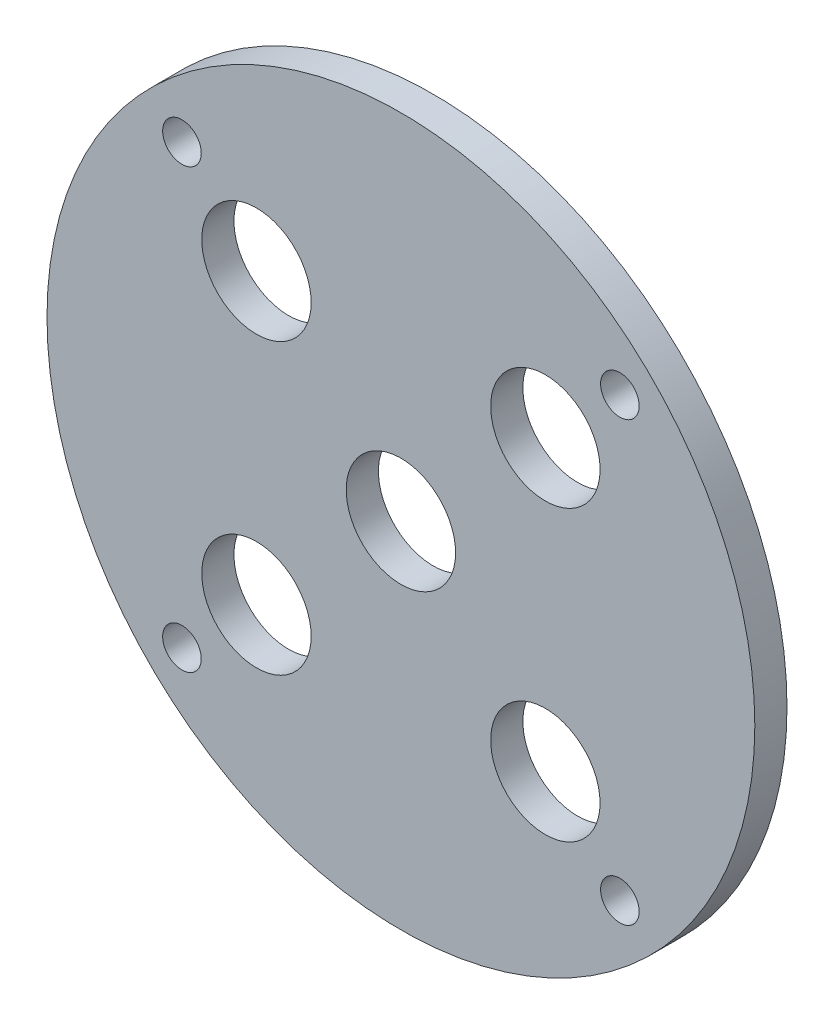
ISO-10303-21;
HEADER;
FILE_DESCRIPTION(('STEP AP214'),'2;1');
FILE_NAME('part.step','',(''),(''),'','','');
FILE_SCHEMA(('AUTOMOTIVE_DESIGN { 1 0 10303 214 1 1 1 1 }'));
ENDSEC;
DATA;
#1=APPLICATION_CONTEXT('core data for automotive mechanical design processes');
#2=APPLICATION_PROTOCOL_DEFINITION('international standard','automotive_design',2000,#1);
#3=PRODUCT_CONTEXT('',#1,'mechanical');
#4=PRODUCT('Part','Part','',(#3));
#5=PRODUCT_RELATED_PRODUCT_CATEGORY('part','',(#4));
#6=PRODUCT_DEFINITION_FORMATION('','',#4);
#7=PRODUCT_DEFINITION_CONTEXT('part definition',#1,'design');
#8=PRODUCT_DEFINITION('design','',#6,#7);
#9=PRODUCT_DEFINITION_SHAPE('','',#8);
#10=(LENGTH_UNIT() NAMED_UNIT(*) SI_UNIT(.MILLI.,.METRE.));
#11=(NAMED_UNIT(*) PLANE_ANGLE_UNIT() SI_UNIT($,.RADIAN.));
#12=(NAMED_UNIT(*) SI_UNIT($,.STERADIAN.) SOLID_ANGLE_UNIT());
#13=UNCERTAINTY_MEASURE_WITH_UNIT(LENGTH_MEASURE(1.E-05),#10,'distance_accuracy_value','');
#14=(GEOMETRIC_REPRESENTATION_CONTEXT(3) GLOBAL_UNCERTAINTY_ASSIGNED_CONTEXT((#13)) GLOBAL_UNIT_ASSIGNED_CONTEXT((#10,
#11,#12)) REPRESENTATION_CONTEXT('',''));
#15=CARTESIAN_POINT('',(0.,0.,0.));
#16=DIRECTION('',(0.,0.,1.));
#17=DIRECTION('',(1.,0.,0.));
#18=AXIS2_PLACEMENT_3D('',#15,#16,#17);
#19=CARTESIAN_POINT('',(-4.49012806053457,-4.4902167152098,1.));
#20=DIRECTION('',(0.,0.,-1.));
#21=DIRECTION('',(-1.,0.,0.));
#22=AXIS2_PLACEMENT_3D('',#19,#20,#21);
#23=CYLINDRICAL_SURFACE('',#22,1.7);
#24=CARTESIAN_POINT('',(-4.49012806053457,-4.4902167152098,1.));
#25=DIRECTION('',(0.,0.,1.));
#26=DIRECTION('',(1.,0.,0.));
#27=AXIS2_PLACEMENT_3D('',#24,#25,#26);
#28=CIRCLE('',#27,1.7);
#29=CARTESIAN_POINT('',(-2.79012806053457,-4.4902167152098,1.));
#30=VERTEX_POINT('',#29);
#31=EDGE_CURVE('E54',#30,#30,#28,.T.);
#32=ORIENTED_EDGE('',*,*,#31,.T.);
#33=EDGE_LOOP('',(#32));
#34=FACE_BOUND('',#33,.T.);
#35=CARTESIAN_POINT('',(-4.49012806053457,-4.4902167152098,0.));
#36=DIRECTION('',(0.,0.,1.));
#37=DIRECTION('',(1.,0.,0.));
#38=AXIS2_PLACEMENT_3D('',#35,#36,#37);
#39=CIRCLE('',#38,1.7);
#40=CARTESIAN_POINT('',(-2.79012806053457,-4.4902167152098,0.));
#41=VERTEX_POINT('',#40);
#42=EDGE_CURVE('E95',#41,#41,#39,.T.);
#43=ORIENTED_EDGE('',*,*,#42,.F.);
#44=EDGE_LOOP('',(#43));
#45=FACE_BOUND('',#44,.T.);
#46=ADVANCED_FACE('F45',(#34,#45),#23,.F.);
#47=CARTESIAN_POINT('',(-4.4901280605346,4.49003940585933,1.));
#48=DIRECTION('',(0.,0.,-1.));
#49=DIRECTION('',(-1.,0.,0.));
#50=AXIS2_PLACEMENT_3D('',#47,#48,#49);
#51=CYLINDRICAL_SURFACE('',#50,1.7);
#52=CARTESIAN_POINT('',(-4.4901280605346,4.49003940585933,1.));
#53=DIRECTION('',(0.,0.,1.));
#54=DIRECTION('',(1.,0.,0.));
#55=AXIS2_PLACEMENT_3D('',#52,#53,#54);
#56=CIRCLE('',#55,1.7);
#57=CARTESIAN_POINT('',(-2.7901280605346,4.49003940585933,1.));
#58=VERTEX_POINT('',#57);
#59=EDGE_CURVE('E60',#58,#58,#56,.T.);
#60=ORIENTED_EDGE('',*,*,#59,.T.);
#61=EDGE_LOOP('',(#60));
#62=FACE_BOUND('',#61,.T.);
#63=CARTESIAN_POINT('',(-4.4901280605346,4.49003940585933,0.));
#64=DIRECTION('',(0.,0.,1.));
#65=DIRECTION('',(1.,0.,0.));
#66=AXIS2_PLACEMENT_3D('',#63,#64,#65);
#67=CIRCLE('',#66,1.7);
#68=CARTESIAN_POINT('',(-2.7901280605346,4.49003940585933,0.));
#69=VERTEX_POINT('',#68);
#70=EDGE_CURVE('E92',#69,#69,#67,.T.);
#71=ORIENTED_EDGE('',*,*,#70,.F.);
#72=EDGE_LOOP('',(#71));
#73=FACE_BOUND('',#72,.T.);
#74=ADVANCED_FACE('F138',(#62,#73),#51,.F.);
#75=CARTESIAN_POINT('',(0.,-8.86546752233539E-05,1.));
#76=DIRECTION('',(0.,0.,-1.));
#77=DIRECTION('',(-1.,0.,0.));
#78=AXIS2_PLACEMENT_3D('',#75,#76,#77);
#79=CYLINDRICAL_SURFACE('',#78,1.7);
#80=CARTESIAN_POINT('',(0.,-8.86546752233539E-05,1.));
#81=DIRECTION('',(0.,0.,1.));
#82=DIRECTION('',(1.,0.,0.));
#83=AXIS2_PLACEMENT_3D('',#80,#81,#82);
#84=CIRCLE('',#83,1.7);
#85=CARTESIAN_POINT('',(1.7,-8.86546752233539E-05,1.));
#86=VERTEX_POINT('',#85);
#87=EDGE_CURVE('E131',#86,#86,#84,.T.);
#88=ORIENTED_EDGE('',*,*,#87,.T.);
#89=EDGE_LOOP('',(#88));
#90=FACE_BOUND('',#89,.T.);
#91=CARTESIAN_POINT('',(0.,-8.86546752233539E-05,0.));
#92=DIRECTION('',(0.,0.,1.));
#93=DIRECTION('',(1.,0.,0.));
#94=AXIS2_PLACEMENT_3D('',#91,#92,#93);
#95=CIRCLE('',#94,1.7);
#96=CARTESIAN_POINT('',(1.7,-8.86546752233539E-05,0.));
#97=VERTEX_POINT('',#96);
#98=EDGE_CURVE('E88',#97,#97,#95,.T.);
#99=ORIENTED_EDGE('',*,*,#98,.F.);
#100=EDGE_LOOP('',(#99));
#101=FACE_BOUND('',#100,.T.);
#102=ADVANCED_FACE('F156',(#90,#101),#79,.F.);
#103=CARTESIAN_POINT('',(4.4901280605346,4.49003940585933,1.));
#104=DIRECTION('',(0.,0.,-1.));
#105=DIRECTION('',(-1.,0.,0.));
#106=AXIS2_PLACEMENT_3D('',#103,#104,#105);
#107=CYLINDRICAL_SURFACE('',#106,1.7);
#108=CARTESIAN_POINT('',(4.4901280605346,4.49003940585933,1.));
#109=DIRECTION('',(0.,0.,1.));
#110=DIRECTION('',(1.,0.,0.));
#111=AXIS2_PLACEMENT_3D('',#108,#109,#110);
#112=CIRCLE('',#111,1.7);
#113=CARTESIAN_POINT('',(6.1901280605346,4.49003940585933,1.));
#114=VERTEX_POINT('',#113);
#115=EDGE_CURVE('E127',#114,#114,#112,.T.);
#116=ORIENTED_EDGE('',*,*,#115,.T.);
#117=EDGE_LOOP('',(#116));
#118=FACE_BOUND('',#117,.T.);
#119=CARTESIAN_POINT('',(4.4901280605346,4.49003940585933,0.));
#120=DIRECTION('',(0.,0.,1.));
#121=DIRECTION('',(1.,0.,0.));
#122=AXIS2_PLACEMENT_3D('',#119,#120,#121);
#123=CIRCLE('',#122,1.7);
#124=CARTESIAN_POINT('',(6.1901280605346,4.49003940585933,0.));
#125=VERTEX_POINT('',#124);
#126=EDGE_CURVE('E84',#125,#125,#123,.T.);
#127=ORIENTED_EDGE('',*,*,#126,.F.);
#128=EDGE_LOOP('',(#127));
#129=FACE_BOUND('',#128,.T.);
#130=ADVANCED_FACE('F163',(#118,#129),#107,.F.);
#131=CARTESIAN_POINT('',(6.80544956505807,-6.80553821973334,1.));
#132=DIRECTION('',(0.,0.,-1.));
#133=DIRECTION('',(-1.,0.,0.));
#134=AXIS2_PLACEMENT_3D('',#131,#132,#133);
#135=CYLINDRICAL_SURFACE('',#134,0.6);
#136=CARTESIAN_POINT('',(6.80544956505807,-6.80553821973334,1.));
#137=DIRECTION('',(0.,0.,1.));
#138=DIRECTION('',(1.,0.,0.));
#139=AXIS2_PLACEMENT_3D('',#136,#137,#138);
#140=CIRCLE('',#139,0.6);
#141=CARTESIAN_POINT('',(7.40544956505807,-6.80553821973334,1.));
#142=VERTEX_POINT('',#141);
#143=EDGE_CURVE('E123',#142,#142,#140,.T.);
#144=ORIENTED_EDGE('',*,*,#143,.T.);
#145=EDGE_LOOP('',(#144));
#146=FACE_BOUND('',#145,.T.);
#147=CARTESIAN_POINT('',(6.80544956505807,-6.80553821973334,0.));
#148=DIRECTION('',(0.,0.,1.));
#149=DIRECTION('',(1.,0.,0.));
#150=AXIS2_PLACEMENT_3D('',#147,#148,#149);
#151=CIRCLE('',#150,0.6);
#152=CARTESIAN_POINT('',(7.40544956505807,-6.80553821973334,0.));
#153=VERTEX_POINT('',#152);
#154=EDGE_CURVE('E80',#153,#153,#151,.T.);
#155=ORIENTED_EDGE('',*,*,#154,.F.);
#156=EDGE_LOOP('',(#155));
#157=FACE_BOUND('',#156,.T.);
#158=ADVANCED_FACE('F167',(#146,#157),#135,.F.);
#159=CARTESIAN_POINT('',(-6.80553821973336,-6.80544956505805,1.));
#160=DIRECTION('',(0.,0.,-1.));
#161=DIRECTION('',(-1.,0.,0.));
#162=AXIS2_PLACEMENT_3D('',#159,#160,#161);
#163=CYLINDRICAL_SURFACE('',#162,0.6);
#164=CARTESIAN_POINT('',(-6.80553821973336,-6.80544956505805,1.));
#165=DIRECTION('',(0.,0.,1.));
#166=DIRECTION('',(1.,0.,0.));
#167=AXIS2_PLACEMENT_3D('',#164,#165,#166);
#168=CIRCLE('',#167,0.6);
#169=CARTESIAN_POINT('',(-6.20553821973336,-6.80544956505805,1.));
#170=VERTEX_POINT('',#169);
#171=EDGE_CURVE('E119',#170,#170,#168,.T.);
#172=ORIENTED_EDGE('',*,*,#171,.T.);
#173=EDGE_LOOP('',(#172));
#174=FACE_BOUND('',#173,.T.);
#175=CARTESIAN_POINT('',(-6.80553821973336,-6.80544956505805,0.));
#176=DIRECTION('',(0.,0.,1.));
#177=DIRECTION('',(1.,0.,0.));
#178=AXIS2_PLACEMENT_3D('',#175,#176,#177);
#179=CIRCLE('',#178,0.6);
#180=CARTESIAN_POINT('',(-6.20553821973336,-6.80544956505805,0.));
#181=VERTEX_POINT('',#180);
#182=EDGE_CURVE('E76',#181,#181,#179,.T.);
#183=ORIENTED_EDGE('',*,*,#182,.F.);
#184=EDGE_LOOP('',(#183));
#185=FACE_BOUND('',#184,.T.);
#186=ADVANCED_FACE('F171',(#174,#185),#163,.F.);
#187=CARTESIAN_POINT('',(-6.80544956505803,6.80553821973339,1.));
#188=DIRECTION('',(0.,0.,-1.));
#189=DIRECTION('',(-1.,0.,0.));
#190=AXIS2_PLACEMENT_3D('',#187,#188,#189);
#191=CYLINDRICAL_SURFACE('',#190,0.6);
#192=CARTESIAN_POINT('',(-6.80544956505803,6.80553821973339,1.));
#193=DIRECTION('',(0.,0.,1.));
#194=DIRECTION('',(1.,0.,0.));
#195=AXIS2_PLACEMENT_3D('',#192,#193,#194);
#196=CIRCLE('',#195,0.6);
#197=CARTESIAN_POINT('',(-6.20544956505803,6.80553821973339,1.));
#198=VERTEX_POINT('',#197);
#199=EDGE_CURVE('E113',#198,#198,#196,.T.);
#200=ORIENTED_EDGE('',*,*,#199,.T.);
#201=EDGE_LOOP('',(#200));
#202=FACE_BOUND('',#201,.T.);
#203=CARTESIAN_POINT('',(-6.80544956505803,6.80553821973339,0.));
#204=DIRECTION('',(0.,0.,1.));
#205=DIRECTION('',(1.,0.,0.));
#206=AXIS2_PLACEMENT_3D('',#203,#204,#205);
#207=CIRCLE('',#206,0.6);
#208=CARTESIAN_POINT('',(-6.20544956505803,6.80553821973339,0.));
#209=VERTEX_POINT('',#208);
#210=EDGE_CURVE('E72',#209,#209,#207,.T.);
#211=ORIENTED_EDGE('',*,*,#210,.F.);
#212=EDGE_LOOP('',(#211));
#213=FACE_BOUND('',#212,.T.);
#214=ADVANCED_FACE('F175',(#202,#213),#191,.F.);
#215=CARTESIAN_POINT('',(6.80553821973331,6.8054495650581,1.));
#216=DIRECTION('',(0.,0.,-1.));
#217=DIRECTION('',(-1.,0.,0.));
#218=AXIS2_PLACEMENT_3D('',#215,#216,#217);
#219=CYLINDRICAL_SURFACE('',#218,0.6);
#220=CARTESIAN_POINT('',(6.80553821973331,6.8054495650581,1.));
#221=DIRECTION('',(0.,0.,1.));
#222=DIRECTION('',(1.,0.,0.));
#223=AXIS2_PLACEMENT_3D('',#220,#221,#222);
#224=CIRCLE('',#223,0.6);
#225=CARTESIAN_POINT('',(7.40553821973331,6.8054495650581,1.));
#226=VERTEX_POINT('',#225);
#227=EDGE_CURVE('E107',#226,#226,#224,.T.);
#228=ORIENTED_EDGE('',*,*,#227,.T.);
#229=EDGE_LOOP('',(#228));
#230=FACE_BOUND('',#229,.T.);
#231=CARTESIAN_POINT('',(6.80553821973331,6.8054495650581,0.));
#232=DIRECTION('',(0.,0.,1.));
#233=DIRECTION('',(1.,0.,0.));
#234=AXIS2_PLACEMENT_3D('',#231,#232,#233);
#235=CIRCLE('',#234,0.6);
#236=CARTESIAN_POINT('',(7.40553821973331,6.8054495650581,0.));
#237=VERTEX_POINT('',#236);
#238=EDGE_CURVE('E68',#237,#237,#235,.T.);
#239=ORIENTED_EDGE('',*,*,#238,.F.);
#240=EDGE_LOOP('',(#239));
#241=FACE_BOUND('',#240,.T.);
#242=ADVANCED_FACE('F178',(#230,#241),#219,.F.);
#243=CARTESIAN_POINT('',(0.,-8.86546752233539E-05,1.));
#244=DIRECTION('',(0.,0.,-1.));
#245=DIRECTION('',(-1.,0.,0.));
#246=AXIS2_PLACEMENT_3D('',#243,#244,#245);
#247=CYLINDRICAL_SURFACE('',#246,11.);
#248=CARTESIAN_POINT('',(0.,-8.86546752233539E-05,1.));
#249=DIRECTION('',(0.,0.,1.));
#250=DIRECTION('',(1.,0.,0.));
#251=AXIS2_PLACEMENT_3D('',#248,#249,#250);
#252=CIRCLE('',#251,11.);
#253=CARTESIAN_POINT('',(11.,-8.86546752233539E-05,1.));
#254=VERTEX_POINT('',#253);
#255=EDGE_CURVE('E102',#254,#254,#252,.T.);
#256=ORIENTED_EDGE('',*,*,#255,.F.);
#257=EDGE_LOOP('',(#256));
#258=FACE_BOUND('',#257,.T.);
#259=CARTESIAN_POINT('',(0.,-8.86546752233539E-05,0.));
#260=DIRECTION('',(0.,0.,1.));
#261=DIRECTION('',(1.,0.,0.));
#262=AXIS2_PLACEMENT_3D('',#259,#260,#261);
#263=CIRCLE('',#262,11.);
#264=CARTESIAN_POINT('',(11.,-8.86546752233539E-05,0.));
#265=VERTEX_POINT('',#264);
#266=EDGE_CURVE('E64',#265,#265,#263,.T.);
#267=ORIENTED_EDGE('',*,*,#266,.T.);
#268=EDGE_LOOP('',(#267));
#269=FACE_BOUND('',#268,.T.);
#270=ADVANCED_FACE('F47',(#258,#269),#247,.T.);
#271=CARTESIAN_POINT('',(4.4901280605346,-4.4902167152098,1.));
#272=DIRECTION('',(0.,0.,-1.));
#273=DIRECTION('',(-1.,0.,0.));
#274=AXIS2_PLACEMENT_3D('',#271,#272,#273);
#275=CYLINDRICAL_SURFACE('',#274,1.7);
#276=CARTESIAN_POINT('',(4.4901280605346,-4.4902167152098,1.));
#277=DIRECTION('',(0.,0.,1.));
#278=DIRECTION('',(1.,0.,0.));
#279=AXIS2_PLACEMENT_3D('',#276,#277,#278);
#280=CIRCLE('',#279,1.7);
#281=CARTESIAN_POINT('',(6.1901280605346,-4.4902167152098,1.));
#282=VERTEX_POINT('',#281);
#283=EDGE_CURVE('E10',#282,#282,#280,.T.);
#284=ORIENTED_EDGE('',*,*,#283,.T.);
#285=EDGE_LOOP('',(#284));
#286=FACE_BOUND('',#285,.T.);
#287=CARTESIAN_POINT('',(4.4901280605346,-4.4902167152098,0.));
#288=DIRECTION('',(0.,0.,1.));
#289=DIRECTION('',(1.,0.,0.));
#290=AXIS2_PLACEMENT_3D('',#287,#288,#289);
#291=CIRCLE('',#290,1.7);
#292=CARTESIAN_POINT('',(6.1901280605346,-4.4902167152098,0.));
#293=VERTEX_POINT('',#292);
#294=EDGE_CURVE('E49',#293,#293,#291,.T.);
#295=ORIENTED_EDGE('',*,*,#294,.F.);
#296=EDGE_LOOP('',(#295));
#297=FACE_BOUND('',#296,.T.);
#298=ADVANCED_FACE('F145',(#286,#297),#275,.F.);
#299=CARTESIAN_POINT('',(0.,0.,1.));
#300=DIRECTION('',(0.,0.,1.));
#301=DIRECTION('',(1.,0.,0.));
#302=AXIS2_PLACEMENT_3D('',#299,#300,#301);
#303=PLANE('',#302);
#304=ORIENTED_EDGE('',*,*,#255,.T.);
#305=EDGE_LOOP('',(#304));
#306=FACE_BOUND('',#305,.T.);
#307=ORIENTED_EDGE('',*,*,#227,.F.);
#308=EDGE_LOOP('',(#307));
#309=FACE_BOUND('',#308,.T.);
#310=ORIENTED_EDGE('',*,*,#199,.F.);
#311=EDGE_LOOP('',(#310));
#312=FACE_BOUND('',#311,.T.);
#313=ORIENTED_EDGE('',*,*,#171,.F.);
#314=EDGE_LOOP('',(#313));
#315=FACE_BOUND('',#314,.T.);
#316=ORIENTED_EDGE('',*,*,#143,.F.);
#317=EDGE_LOOP('',(#316));
#318=FACE_BOUND('',#317,.T.);
#319=ORIENTED_EDGE('',*,*,#115,.F.);
#320=EDGE_LOOP('',(#319));
#321=FACE_BOUND('',#320,.T.);
#322=ORIENTED_EDGE('',*,*,#87,.F.);
#323=EDGE_LOOP('',(#322));
#324=FACE_BOUND('',#323,.T.);
#325=ORIENTED_EDGE('',*,*,#59,.F.);
#326=EDGE_LOOP('',(#325));
#327=FACE_BOUND('',#326,.T.);
#328=ORIENTED_EDGE('',*,*,#31,.F.);
#329=EDGE_LOOP('',(#328));
#330=FACE_BOUND('',#329,.T.);
#331=ORIENTED_EDGE('',*,*,#283,.F.);
#332=EDGE_LOOP('',(#331));
#333=FACE_BOUND('',#332,.T.);
#334=ADVANCED_FACE('F141',(#306,#309,#312,#315,#318,#321,#324,#327,#330,#333),#303,.T.);
#335=CARTESIAN_POINT('',(0.,0.,0.));
#336=DIRECTION('',(0.,0.,1.));
#337=DIRECTION('',(1.,0.,0.));
#338=AXIS2_PLACEMENT_3D('',#335,#336,#337);
#339=PLANE('',#338);
#340=ORIENTED_EDGE('',*,*,#266,.F.);
#341=EDGE_LOOP('',(#340));
#342=FACE_BOUND('',#341,.T.);
#343=ORIENTED_EDGE('',*,*,#238,.T.);
#344=EDGE_LOOP('',(#343));
#345=FACE_BOUND('',#344,.T.);
#346=ORIENTED_EDGE('',*,*,#210,.T.);
#347=EDGE_LOOP('',(#346));
#348=FACE_BOUND('',#347,.T.);
#349=ORIENTED_EDGE('',*,*,#182,.T.);
#350=EDGE_LOOP('',(#349));
#351=FACE_BOUND('',#350,.T.);
#352=ORIENTED_EDGE('',*,*,#154,.T.);
#353=EDGE_LOOP('',(#352));
#354=FACE_BOUND('',#353,.T.);
#355=ORIENTED_EDGE('',*,*,#126,.T.);
#356=EDGE_LOOP('',(#355));
#357=FACE_BOUND('',#356,.T.);
#358=ORIENTED_EDGE('',*,*,#98,.T.);
#359=EDGE_LOOP('',(#358));
#360=FACE_BOUND('',#359,.T.);
#361=ORIENTED_EDGE('',*,*,#70,.T.);
#362=EDGE_LOOP('',(#361));
#363=FACE_BOUND('',#362,.T.);
#364=ORIENTED_EDGE('',*,*,#42,.T.);
#365=EDGE_LOOP('',(#364));
#366=FACE_BOUND('',#365,.T.);
#367=ORIENTED_EDGE('',*,*,#294,.T.);
#368=EDGE_LOOP('',(#367));
#369=FACE_BOUND('',#368,.T.);
#370=ADVANCED_FACE('F144',(#342,#345,#348,#351,#354,#357,#360,#363,#366,#369),#339,.F.);
#371=CLOSED_SHELL('',(#46,#74,#102,#130,#158,#186,#214,#242,#270,#298,#334,#370));
#372=MANIFOLD_SOLID_BREP('B2',#371);
#373=ADVANCED_BREP_SHAPE_REPRESENTATION('',(#18,#372),#14);
#374=SHAPE_DEFINITION_REPRESENTATION(#9,#373);
ENDSEC;
END-ISO-10303-21;
